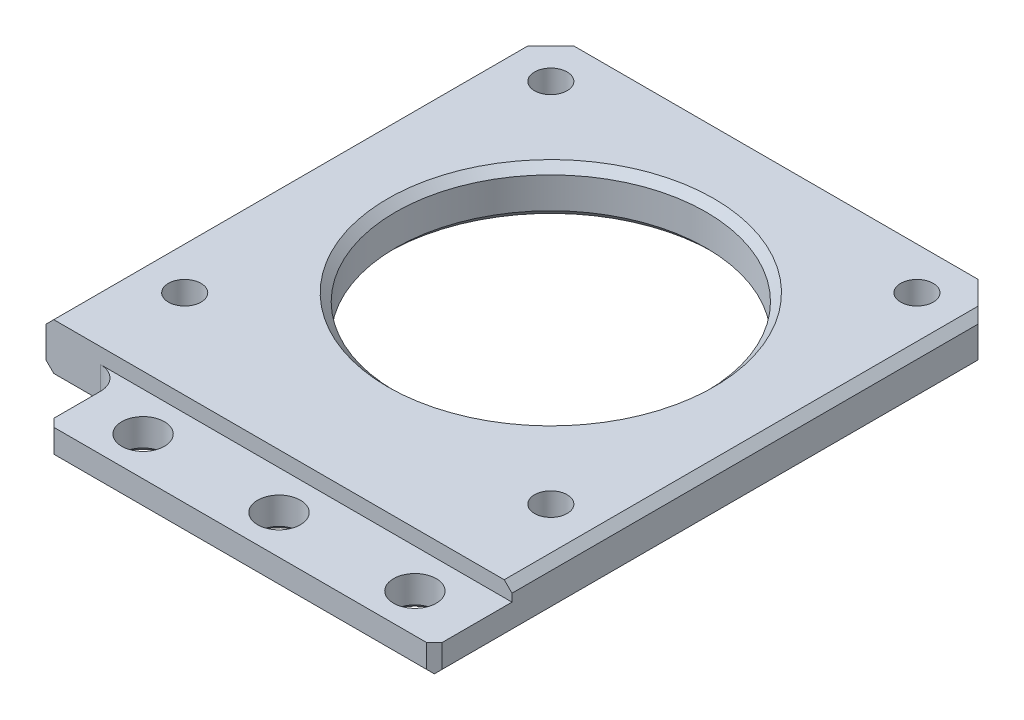
ISO-10303-21;
HEADER;
FILE_DESCRIPTION(('STEP AP214'),'2;1');
FILE_NAME('part.step','',(''),(''),'','','');
FILE_SCHEMA(('AUTOMOTIVE_DESIGN { 1 0 10303 214 1 1 1 1 }'));
ENDSEC;
DATA;
#1=APPLICATION_CONTEXT('core data for automotive mechanical design processes');
#2=APPLICATION_PROTOCOL_DEFINITION('international standard','automotive_design',2000,#1);
#3=PRODUCT_CONTEXT('',#1,'mechanical');
#4=PRODUCT('Part','Part','',(#3));
#5=PRODUCT_RELATED_PRODUCT_CATEGORY('part','',(#4));
#6=PRODUCT_DEFINITION_FORMATION('','',#4);
#7=PRODUCT_DEFINITION_CONTEXT('part definition',#1,'design');
#8=PRODUCT_DEFINITION('design','',#6,#7);
#9=PRODUCT_DEFINITION_SHAPE('','',#8);
#10=(LENGTH_UNIT() NAMED_UNIT(*) SI_UNIT(.MILLI.,.METRE.));
#11=(NAMED_UNIT(*) PLANE_ANGLE_UNIT() SI_UNIT($,.RADIAN.));
#12=(NAMED_UNIT(*) SI_UNIT($,.STERADIAN.) SOLID_ANGLE_UNIT());
#13=UNCERTAINTY_MEASURE_WITH_UNIT(LENGTH_MEASURE(1.E-05),#10,'distance_accuracy_value','');
#14=(GEOMETRIC_REPRESENTATION_CONTEXT(3) GLOBAL_UNCERTAINTY_ASSIGNED_CONTEXT((#13)) GLOBAL_UNIT_ASSIGNED_CONTEXT((#10,
#11,#12)) REPRESENTATION_CONTEXT('',''));
#15=CARTESIAN_POINT('',(0.,0.,0.));
#16=DIRECTION('',(0.,0.,1.));
#17=DIRECTION('',(1.,0.,0.));
#18=AXIS2_PLACEMENT_3D('',#15,#16,#17);
#19=CARTESIAN_POINT('',(52.5,0.500000000000011,-5.));
#20=DIRECTION('',(0.,-1.,0.));
#21=DIRECTION('',(0.,0.,-1.));
#22=AXIS2_PLACEMENT_3D('',#19,#20,#21);
#23=CONICAL_SURFACE('',#22,2.75,0.785398163397439);
#24=CARTESIAN_POINT('',(52.5,0.500000000000011,-5.));
#25=DIRECTION('',(0.,-1.,0.));
#26=DIRECTION('',(0.,0.,-1.));
#27=AXIS2_PLACEMENT_3D('',#24,#25,#26);
#28=CIRCLE('',#27,2.75);
#29=CARTESIAN_POINT('',(52.5,0.500000000000011,-7.75));
#30=VERTEX_POINT('',#29);
#31=EDGE_CURVE('E390',#30,#30,#28,.T.);
#32=ORIENTED_EDGE('',*,*,#31,.F.);
#33=EDGE_LOOP('',(#32));
#34=FACE_BOUND('',#33,.T.);
#35=CARTESIAN_POINT('',(52.5,0.,-5.));
#36=DIRECTION('',(0.,1.,0.));
#37=DIRECTION('',(0.,0.,-1.));
#38=AXIS2_PLACEMENT_3D('',#35,#36,#37);
#39=CIRCLE('',#38,3.25);
#40=CARTESIAN_POINT('',(52.5,0.,-8.25));
#41=VERTEX_POINT('',#40);
#42=EDGE_CURVE('E267',#41,#41,#39,.T.);
#43=ORIENTED_EDGE('',*,*,#42,.F.);
#44=EDGE_LOOP('',(#43));
#45=FACE_BOUND('',#44,.T.);
#46=ADVANCED_FACE('F17',(#34,#45),#23,.F.);
#47=CARTESIAN_POINT('',(35.,0.500000000000011,-5.));
#48=DIRECTION('',(0.,-1.,0.));
#49=DIRECTION('',(0.,0.,-1.));
#50=AXIS2_PLACEMENT_3D('',#47,#48,#49);
#51=CONICAL_SURFACE('',#50,2.75,0.785398163397439);
#52=CARTESIAN_POINT('',(35.,0.500000000000011,-5.));
#53=DIRECTION('',(0.,-1.,0.));
#54=DIRECTION('',(0.,0.,-1.));
#55=AXIS2_PLACEMENT_3D('',#52,#53,#54);
#56=CIRCLE('',#55,2.75);
#57=CARTESIAN_POINT('',(35.,0.500000000000011,-7.75));
#58=VERTEX_POINT('',#57);
#59=EDGE_CURVE('E286',#58,#58,#56,.T.);
#60=ORIENTED_EDGE('',*,*,#59,.F.);
#61=EDGE_LOOP('',(#60));
#62=FACE_BOUND('',#61,.T.);
#63=CARTESIAN_POINT('',(35.,0.,-5.));
#64=DIRECTION('',(0.,1.,0.));
#65=DIRECTION('',(0.,0.,-1.));
#66=AXIS2_PLACEMENT_3D('',#63,#64,#65);
#67=CIRCLE('',#66,3.25);
#68=CARTESIAN_POINT('',(35.,0.,-8.25));
#69=VERTEX_POINT('',#68);
#70=EDGE_CURVE('E293',#69,#69,#67,.T.);
#71=ORIENTED_EDGE('',*,*,#70,.F.);
#72=EDGE_LOOP('',(#71));
#73=FACE_BOUND('',#72,.T.);
#74=ADVANCED_FACE('F1122',(#62,#73),#51,.F.);
#75=CARTESIAN_POINT('',(17.5,0.500000000000014,-5.));
#76=DIRECTION('',(0.,-1.,0.));
#77=DIRECTION('',(0.,0.,-1.));
#78=AXIS2_PLACEMENT_3D('',#75,#76,#77);
#79=CONICAL_SURFACE('',#78,2.75,0.785398163397439);
#80=CARTESIAN_POINT('',(17.5,0.500000000000014,-5.));
#81=DIRECTION('',(0.,-1.,0.));
#82=DIRECTION('',(0.,0.,-1.));
#83=AXIS2_PLACEMENT_3D('',#80,#81,#82);
#84=CIRCLE('',#83,2.75);
#85=CARTESIAN_POINT('',(17.5,0.500000000000014,-7.75));
#86=VERTEX_POINT('',#85);
#87=EDGE_CURVE('E396',#86,#86,#84,.T.);
#88=ORIENTED_EDGE('',*,*,#87,.F.);
#89=EDGE_LOOP('',(#88));
#90=FACE_BOUND('',#89,.T.);
#91=CARTESIAN_POINT('',(17.5,0.,-5.));
#92=DIRECTION('',(0.,1.,0.));
#93=DIRECTION('',(0.,0.,-1.));
#94=AXIS2_PLACEMENT_3D('',#91,#92,#93);
#95=CIRCLE('',#94,3.25);
#96=CARTESIAN_POINT('',(17.5,0.,-8.25));
#97=VERTEX_POINT('',#96);
#98=EDGE_CURVE('E297',#97,#97,#95,.T.);
#99=ORIENTED_EDGE('',*,*,#98,.F.);
#100=EDGE_LOOP('',(#99));
#101=FACE_BOUND('',#100,.T.);
#102=ADVANCED_FACE('F1117',(#90,#101),#79,.F.);
#103=CARTESIAN_POINT('',(10.,0.,-1.00000000000001));
#104=DIRECTION('',(0.707106781186548,0.,-0.707106781186548));
#105=DIRECTION('',(0.,-1.,0.));
#106=AXIS2_PLACEMENT_3D('',#103,#104,#105);
#107=PLANE('',#106);
#108=DIRECTION('',(-0.577350269189626,-0.577350269189626,-0.577350269189626));
#109=VECTOR('',#108,1.);
#110=CARTESIAN_POINT('',(7.33333333333335,-2.66666666666668,-3.66666666666667));
#111=LINE('',#110,#109);
#112=CARTESIAN_POINT('',(11.,0.999999999999987,0.));
#113=VERTEX_POINT('',#112);
#114=CARTESIAN_POINT('',(10.,0.,-0.999999999999987));
#115=VERTEX_POINT('',#114);
#116=EDGE_CURVE('E232',#113,#115,#111,.T.);
#117=ORIENTED_EDGE('',*,*,#116,.F.);
#118=DIRECTION('',(0.,-1.,0.));
#119=VECTOR('',#118,1.);
#120=CARTESIAN_POINT('',(11.,6.,0.));
#121=LINE('',#120,#119);
#122=CARTESIAN_POINT('',(11.,4.,0.));
#123=VERTEX_POINT('',#122);
#124=EDGE_CURVE('E247',#123,#113,#121,.T.);
#125=ORIENTED_EDGE('',*,*,#124,.F.);
#126=DIRECTION('',(0.707106781186548,0.,0.707106781186548));
#127=VECTOR('',#126,1.);
#128=CARTESIAN_POINT('',(10.,4.,-1.00000000000001));
#129=LINE('',#128,#127);
#130=CARTESIAN_POINT('',(10.,4.,-1.00000000000001));
#131=VERTEX_POINT('',#130);
#132=EDGE_CURVE('E403',#131,#123,#129,.T.);
#133=ORIENTED_EDGE('',*,*,#132,.F.);
#134=DIRECTION('',(0.,1.,0.));
#135=VECTOR('',#134,1.);
#136=CARTESIAN_POINT('',(10.,0.,-1.00000000000001));
#137=LINE('',#136,#135);
#138=EDGE_CURVE('E26',#115,#131,#137,.T.);
#139=ORIENTED_EDGE('',*,*,#138,.F.);
#140=EDGE_LOOP('',(#117,#125,#133,#139));
#141=FACE_BOUND('',#140,.T.);
#142=ADVANCED_FACE('F1121',(#141),#107,.F.);
#143=CARTESIAN_POINT('',(7.,4.,-7.));
#144=DIRECTION('',(0.,-1.,0.));
#145=DIRECTION('',(0.,0.,-1.));
#146=AXIS2_PLACEMENT_3D('',#143,#144,#145);
#147=CYLINDRICAL_SURFACE('',#146,3.);
#148=CARTESIAN_POINT('',(7.,0.,-7.));
#149=DIRECTION('',(0.,1.,0.));
#150=DIRECTION('',(0.,0.,-1.));
#151=AXIS2_PLACEMENT_3D('',#148,#149,#150);
#152=CIRCLE('',#151,3.);
#153=CARTESIAN_POINT('',(10.,0.,-7.));
#154=VERTEX_POINT('',#153);
#155=CARTESIAN_POINT('',(7.,0.,-10.));
#156=VERTEX_POINT('',#155);
#157=EDGE_CURVE('E334',#154,#156,#152,.T.);
#158=ORIENTED_EDGE('',*,*,#157,.F.);
#159=DIRECTION('',(0.,-1.,0.));
#160=VECTOR('',#159,1.);
#161=CARTESIAN_POINT('',(10.,0.,-7.));
#162=LINE('',#161,#160);
#163=CARTESIAN_POINT('',(10.,4.,-7.));
#164=VERTEX_POINT('',#163);
#165=EDGE_CURVE('E11',#164,#154,#162,.T.);
#166=ORIENTED_EDGE('',*,*,#165,.F.);
#167=CARTESIAN_POINT('',(7.,4.,-7.));
#168=DIRECTION('',(0.,-1.,0.));
#169=DIRECTION('',(0.,0.,-1.));
#170=AXIS2_PLACEMENT_3D('',#167,#168,#169);
#171=CIRCLE('',#170,3.);
#172=CARTESIAN_POINT('',(7.,4.,-10.));
#173=VERTEX_POINT('',#172);
#174=EDGE_CURVE('E258',#173,#164,#171,.T.);
#175=ORIENTED_EDGE('',*,*,#174,.F.);
#176=DIRECTION('',(0.,1.,0.));
#177=VECTOR('',#176,1.);
#178=CARTESIAN_POINT('',(7.,4.,-10.));
#179=LINE('',#178,#177);
#180=EDGE_CURVE('E262',#156,#173,#179,.T.);
#181=ORIENTED_EDGE('',*,*,#180,.F.);
#182=EDGE_LOOP('',(#158,#166,#175,#181));
#183=FACE_BOUND('',#182,.T.);
#184=ADVANCED_FACE('F1140',(#183),#147,.F.);
#185=CARTESIAN_POINT('',(10.,0.,-10.));
#186=DIRECTION('',(1.,0.,0.));
#187=DIRECTION('',(0.,0.,-1.));
#188=AXIS2_PLACEMENT_3D('',#185,#186,#187);
#189=PLANE('',#188);
#190=DIRECTION('',(0.,0.,-1.));
#191=VECTOR('',#190,1.);
#192=CARTESIAN_POINT('',(10.,0.,-10.));
#193=LINE('',#192,#191);
#194=EDGE_CURVE('E339',#115,#154,#193,.T.);
#195=ORIENTED_EDGE('',*,*,#194,.F.);
#196=ORIENTED_EDGE('',*,*,#138,.T.);
#197=DIRECTION('',(0.,0.,-1.));
#198=VECTOR('',#197,1.);
#199=CARTESIAN_POINT('',(10.,4.,-10.));
#200=LINE('',#199,#198);
#201=EDGE_CURVE('E399',#131,#164,#200,.T.);
#202=ORIENTED_EDGE('',*,*,#201,.T.);
#203=ORIENTED_EDGE('',*,*,#165,.T.);
#204=EDGE_LOOP('',(#195,#196,#202,#203));
#205=FACE_BOUND('',#204,.T.);
#206=ADVANCED_FACE('F1135',(#205),#189,.F.);
#207=CARTESIAN_POINT('',(6.43,0.,-21.43));
#208=DIRECTION('',(0.,-1.,0.));
#209=DIRECTION('',(0.,0.,-1.));
#210=AXIS2_PLACEMENT_3D('',#207,#208,#209);
#211=CONICAL_SURFACE('',#210,2.525,0.785398163397445);
#212=CARTESIAN_POINT('',(6.43,0.425,-21.43));
#213=DIRECTION('',(0.,-1.,0.));
#214=DIRECTION('',(0.,0.,-1.));
#215=AXIS2_PLACEMENT_3D('',#212,#213,#214);
#216=CIRCLE('',#215,2.1);
#217=CARTESIAN_POINT('',(6.43,0.425,-23.53));
#218=VERTEX_POINT('',#217);
#219=EDGE_CURVE('E38',#218,#218,#216,.T.);
#220=ORIENTED_EDGE('',*,*,#219,.F.);
#221=EDGE_LOOP('',(#220));
#222=FACE_BOUND('',#221,.T.);
#223=CARTESIAN_POINT('',(6.43,0.,-21.43));
#224=DIRECTION('',(0.,-1.,0.));
#225=DIRECTION('',(0.,0.,-1.));
#226=AXIS2_PLACEMENT_3D('',#223,#224,#225);
#227=CIRCLE('',#226,2.525);
#228=CARTESIAN_POINT('',(6.43,0.,-23.955));
#229=VERTEX_POINT('',#228);
#230=EDGE_CURVE('E264',#229,#229,#227,.T.);
#231=ORIENTED_EDGE('',*,*,#230,.T.);
#232=EDGE_LOOP('',(#231));
#233=FACE_BOUND('',#232,.T.);
#234=ADVANCED_FACE('F1139',(#222,#233),#211,.F.);
#235=CARTESIAN_POINT('',(6.43,0.,-21.43));
#236=DIRECTION('',(0.,-1.,0.));
#237=DIRECTION('',(0.,0.,-1.));
#238=AXIS2_PLACEMENT_3D('',#235,#236,#237);
#239=CYLINDRICAL_SURFACE('',#238,2.1);
#240=CARTESIAN_POINT('',(6.43,6.,-21.43));
#241=DIRECTION('',(0.,-1.,0.));
#242=DIRECTION('',(0.,0.,-1.));
#243=AXIS2_PLACEMENT_3D('',#240,#241,#242);
#244=CIRCLE('',#243,2.1);
#245=CARTESIAN_POINT('',(6.43,6.,-23.53));
#246=VERTEX_POINT('',#245);
#247=EDGE_CURVE('E243',#246,#246,#244,.T.);
#248=ORIENTED_EDGE('',*,*,#247,.F.);
#249=EDGE_LOOP('',(#248));
#250=FACE_BOUND('',#249,.T.);
#251=ORIENTED_EDGE('',*,*,#219,.T.);
#252=EDGE_LOOP('',(#251));
#253=FACE_BOUND('',#252,.T.);
#254=ADVANCED_FACE('F1049',(#250,#253),#239,.F.);
#255=CARTESIAN_POINT('',(53.57,0.,-68.57));
#256=DIRECTION('',(0.,-1.,0.));
#257=DIRECTION('',(0.,0.,-1.));
#258=AXIS2_PLACEMENT_3D('',#255,#256,#257);
#259=CONICAL_SURFACE('',#258,2.525,0.785398163397445);
#260=CARTESIAN_POINT('',(53.57,0.425,-68.57));
#261=DIRECTION('',(0.,-1.,0.));
#262=DIRECTION('',(0.,0.,-1.));
#263=AXIS2_PLACEMENT_3D('',#260,#261,#262);
#264=CIRCLE('',#263,2.1);
#265=CARTESIAN_POINT('',(53.57,0.425,-70.67));
#266=VERTEX_POINT('',#265);
#267=EDGE_CURVE('E160',#266,#266,#264,.T.);
#268=ORIENTED_EDGE('',*,*,#267,.F.);
#269=EDGE_LOOP('',(#268));
#270=FACE_BOUND('',#269,.T.);
#271=CARTESIAN_POINT('',(53.57,0.,-68.57));
#272=DIRECTION('',(0.,-1.,0.));
#273=DIRECTION('',(0.,0.,-1.));
#274=AXIS2_PLACEMENT_3D('',#271,#272,#273);
#275=CIRCLE('',#274,2.525);
#276=CARTESIAN_POINT('',(53.57,0.,-71.095));
#277=VERTEX_POINT('',#276);
#278=EDGE_CURVE('E199',#277,#277,#275,.T.);
#279=ORIENTED_EDGE('',*,*,#278,.T.);
#280=EDGE_LOOP('',(#279));
#281=FACE_BOUND('',#280,.T.);
#282=ADVANCED_FACE('F1044',(#270,#281),#259,.F.);
#283=CARTESIAN_POINT('',(53.57,0.,-68.57));
#284=DIRECTION('',(0.,-1.,0.));
#285=DIRECTION('',(0.,0.,-1.));
#286=AXIS2_PLACEMENT_3D('',#283,#284,#285);
#287=CYLINDRICAL_SURFACE('',#286,2.1);
#288=CARTESIAN_POINT('',(53.57,6.,-68.57));
#289=DIRECTION('',(0.,-1.,0.));
#290=DIRECTION('',(0.,0.,-1.));
#291=AXIS2_PLACEMENT_3D('',#288,#289,#290);
#292=CIRCLE('',#291,2.1);
#293=CARTESIAN_POINT('',(53.57,6.,-70.67));
#294=VERTEX_POINT('',#293);
#295=EDGE_CURVE('E238',#294,#294,#292,.T.);
#296=ORIENTED_EDGE('',*,*,#295,.F.);
#297=EDGE_LOOP('',(#296));
#298=FACE_BOUND('',#297,.T.);
#299=ORIENTED_EDGE('',*,*,#267,.T.);
#300=EDGE_LOOP('',(#299));
#301=FACE_BOUND('',#300,.T.);
#302=ADVANCED_FACE('F1048',(#298,#301),#287,.F.);
#303=CARTESIAN_POINT('',(53.57,0.,-21.43));
#304=DIRECTION('',(0.,-1.,0.));
#305=DIRECTION('',(0.,0.,-1.));
#306=AXIS2_PLACEMENT_3D('',#303,#304,#305);
#307=CONICAL_SURFACE('',#306,2.525,0.785398163397445);
#308=CARTESIAN_POINT('',(53.57,0.425,-21.43));
#309=DIRECTION('',(0.,-1.,0.));
#310=DIRECTION('',(0.,0.,-1.));
#311=AXIS2_PLACEMENT_3D('',#308,#309,#310);
#312=CIRCLE('',#311,2.1);
#313=CARTESIAN_POINT('',(53.57,0.425,-23.53));
#314=VERTEX_POINT('',#313);
#315=EDGE_CURVE('E156',#314,#314,#312,.T.);
#316=ORIENTED_EDGE('',*,*,#315,.F.);
#317=EDGE_LOOP('',(#316));
#318=FACE_BOUND('',#317,.T.);
#319=CARTESIAN_POINT('',(53.57,0.,-21.43));
#320=DIRECTION('',(0.,-1.,0.));
#321=DIRECTION('',(0.,0.,-1.));
#322=AXIS2_PLACEMENT_3D('',#319,#320,#321);
#323=CIRCLE('',#322,2.525);
#324=CARTESIAN_POINT('',(53.57,0.,-23.955));
#325=VERTEX_POINT('',#324);
#326=EDGE_CURVE('E196',#325,#325,#323,.T.);
#327=ORIENTED_EDGE('',*,*,#326,.T.);
#328=EDGE_LOOP('',(#327));
#329=FACE_BOUND('',#328,.T.);
#330=ADVANCED_FACE('F1111',(#318,#329),#307,.F.);
#331=CARTESIAN_POINT('',(53.57,0.,-21.43));
#332=DIRECTION('',(0.,-1.,0.));
#333=DIRECTION('',(0.,0.,-1.));
#334=AXIS2_PLACEMENT_3D('',#331,#332,#333);
#335=CYLINDRICAL_SURFACE('',#334,2.1);
#336=CARTESIAN_POINT('',(53.57,6.,-21.43));
#337=DIRECTION('',(0.,-1.,0.));
#338=DIRECTION('',(0.,0.,-1.));
#339=AXIS2_PLACEMENT_3D('',#336,#337,#338);
#340=CIRCLE('',#339,2.1);
#341=CARTESIAN_POINT('',(53.57,6.,-23.53));
#342=VERTEX_POINT('',#341);
#343=EDGE_CURVE('E242',#342,#342,#340,.T.);
#344=ORIENTED_EDGE('',*,*,#343,.F.);
#345=EDGE_LOOP('',(#344));
#346=FACE_BOUND('',#345,.T.);
#347=ORIENTED_EDGE('',*,*,#315,.T.);
#348=EDGE_LOOP('',(#347));
#349=FACE_BOUND('',#348,.T.);
#350=ADVANCED_FACE('F157',(#346,#349),#335,.F.);
#351=CARTESIAN_POINT('',(6.43,0.,-68.57));
#352=DIRECTION('',(0.,-1.,0.));
#353=DIRECTION('',(0.,0.,-1.));
#354=AXIS2_PLACEMENT_3D('',#351,#352,#353);
#355=CONICAL_SURFACE('',#354,2.525,0.785398163397445);
#356=CARTESIAN_POINT('',(6.43,0.425,-68.57));
#357=DIRECTION('',(0.,-1.,0.));
#358=DIRECTION('',(0.,0.,-1.));
#359=AXIS2_PLACEMENT_3D('',#356,#357,#358);
#360=CIRCLE('',#359,2.1);
#361=CARTESIAN_POINT('',(6.43,0.425,-70.67));
#362=VERTEX_POINT('',#361);
#363=EDGE_CURVE('E148',#362,#362,#360,.T.);
#364=ORIENTED_EDGE('',*,*,#363,.F.);
#365=EDGE_LOOP('',(#364));
#366=FACE_BOUND('',#365,.T.);
#367=CARTESIAN_POINT('',(6.43,0.,-68.57));
#368=DIRECTION('',(0.,-1.,0.));
#369=DIRECTION('',(0.,0.,-1.));
#370=AXIS2_PLACEMENT_3D('',#367,#368,#369);
#371=CIRCLE('',#370,2.525);
#372=CARTESIAN_POINT('',(6.43,0.,-71.095));
#373=VERTEX_POINT('',#372);
#374=EDGE_CURVE('E195',#373,#373,#371,.T.);
#375=ORIENTED_EDGE('',*,*,#374,.T.);
#376=EDGE_LOOP('',(#375));
#377=FACE_BOUND('',#376,.T.);
#378=ADVANCED_FACE('F1082',(#366,#377),#355,.F.);
#379=CARTESIAN_POINT('',(6.43,0.,-68.57));
#380=DIRECTION('',(0.,-1.,0.));
#381=DIRECTION('',(0.,0.,-1.));
#382=AXIS2_PLACEMENT_3D('',#379,#380,#381);
#383=CYLINDRICAL_SURFACE('',#382,2.1);
#384=CARTESIAN_POINT('',(6.43,6.,-68.57));
#385=DIRECTION('',(0.,-1.,0.));
#386=DIRECTION('',(0.,0.,-1.));
#387=AXIS2_PLACEMENT_3D('',#384,#385,#386);
#388=CIRCLE('',#387,2.1);
#389=CARTESIAN_POINT('',(6.43,6.,-70.67));
#390=VERTEX_POINT('',#389);
#391=EDGE_CURVE('E346',#390,#390,#388,.T.);
#392=ORIENTED_EDGE('',*,*,#391,.F.);
#393=EDGE_LOOP('',(#392));
#394=FACE_BOUND('',#393,.T.);
#395=ORIENTED_EDGE('',*,*,#363,.T.);
#396=EDGE_LOOP('',(#395));
#397=FACE_BOUND('',#396,.T.);
#398=ADVANCED_FACE('F1086',(#394,#397),#383,.F.);
#399=CARTESIAN_POINT('',(30.,0.,-45.));
#400=DIRECTION('',(0.,-1.,0.));
#401=DIRECTION('',(0.,0.,-1.));
#402=AXIS2_PLACEMENT_3D('',#399,#400,#401);
#403=CONICAL_SURFACE('',#402,21.,0.785398163397452);
#404=CARTESIAN_POINT('',(30.,1.,-45.));
#405=DIRECTION('',(0.,-1.,0.));
#406=DIRECTION('',(0.,0.,-1.));
#407=AXIS2_PLACEMENT_3D('',#404,#405,#406);
#408=CIRCLE('',#407,20.);
#409=CARTESIAN_POINT('',(30.,1.,-65.));
#410=VERTEX_POINT('',#409);
#411=EDGE_CURVE('E194',#410,#410,#408,.T.);
#412=ORIENTED_EDGE('',*,*,#411,.F.);
#413=EDGE_LOOP('',(#412));
#414=FACE_BOUND('',#413,.T.);
#415=CARTESIAN_POINT('',(30.,0.,-45.));
#416=DIRECTION('',(0.,1.,0.));
#417=DIRECTION('',(0.,0.,-1.));
#418=AXIS2_PLACEMENT_3D('',#415,#416,#417);
#419=CIRCLE('',#418,21.);
#420=CARTESIAN_POINT('',(30.,0.,-66.));
#421=VERTEX_POINT('',#420);
#422=EDGE_CURVE('E190',#421,#421,#419,.T.);
#423=ORIENTED_EDGE('',*,*,#422,.F.);
#424=EDGE_LOOP('',(#423));
#425=FACE_BOUND('',#424,.T.);
#426=ADVANCED_FACE('F1076',(#414,#425),#403,.F.);
#427=CARTESIAN_POINT('',(30.,5.,-45.));
#428=DIRECTION('',(0.,1.,0.));
#429=DIRECTION('',(0.,0.,1.));
#430=AXIS2_PLACEMENT_3D('',#427,#428,#429);
#431=CONICAL_SURFACE('',#430,20.,0.785398163397448);
#432=CARTESIAN_POINT('',(30.,5.,-45.));
#433=DIRECTION('',(0.,1.,0.));
#434=DIRECTION('',(0.,0.,-1.));
#435=AXIS2_PLACEMENT_3D('',#432,#433,#434);
#436=CIRCLE('',#435,20.);
#437=CARTESIAN_POINT('',(30.,5.,-65.));
#438=VERTEX_POINT('',#437);
#439=EDGE_CURVE('E251',#438,#438,#436,.T.);
#440=ORIENTED_EDGE('',*,*,#439,.F.);
#441=EDGE_LOOP('',(#440));
#442=FACE_BOUND('',#441,.T.);
#443=CARTESIAN_POINT('',(30.,6.,-45.));
#444=DIRECTION('',(0.,-1.,0.));
#445=DIRECTION('',(0.,0.,-1.));
#446=AXIS2_PLACEMENT_3D('',#443,#444,#445);
#447=CIRCLE('',#446,21.);
#448=CARTESIAN_POINT('',(30.,6.,-66.));
#449=VERTEX_POINT('',#448);
#450=EDGE_CURVE('E350',#449,#449,#447,.T.);
#451=ORIENTED_EDGE('',*,*,#450,.F.);
#452=EDGE_LOOP('',(#451));
#453=FACE_BOUND('',#452,.T.);
#454=ADVANCED_FACE('F1059',(#442,#453),#431,.F.);
#455=CARTESIAN_POINT('',(60.,6.,-1.));
#456=DIRECTION('',(-0.707106781186548,0.,-0.707106781186548));
#457=DIRECTION('',(-0.707106781186548,0.,0.707106781186548));
#458=AXIS2_PLACEMENT_3D('',#455,#456,#457);
#459=PLANE('',#458);
#460=DIRECTION('',(0.707106781186548,0.,-0.707106781186548));
#461=VECTOR('',#460,1.);
#462=CARTESIAN_POINT('',(60.,4.,-1.));
#463=LINE('',#462,#461);
#464=CARTESIAN_POINT('',(59.,4.,0.));
#465=VERTEX_POINT('',#464);
#466=CARTESIAN_POINT('',(60.,4.,-1.));
#467=VERTEX_POINT('',#466);
#468=EDGE_CURVE('E407',#465,#467,#463,.T.);
#469=ORIENTED_EDGE('',*,*,#468,.F.);
#470=DIRECTION('',(0.,1.,0.));
#471=VECTOR('',#470,1.);
#472=CARTESIAN_POINT('',(59.,6.,0.));
#473=LINE('',#472,#471);
#474=CARTESIAN_POINT('',(59.,0.999999999999987,0.));
#475=VERTEX_POINT('',#474);
#476=EDGE_CURVE('E211',#475,#465,#473,.T.);
#477=ORIENTED_EDGE('',*,*,#476,.F.);
#478=DIRECTION('',(-0.577350269189626,0.577350269189626,0.577350269189626));
#479=VECTOR('',#478,1.);
#480=CARTESIAN_POINT('',(39.3333333333333,20.6666666666667,19.6666666666666));
#481=LINE('',#480,#479);
#482=CARTESIAN_POINT('',(59.5,0.499999999999983,-0.5));
#483=VERTEX_POINT('',#482);
#484=EDGE_CURVE('E207',#483,#475,#481,.T.);
#485=ORIENTED_EDGE('',*,*,#484,.F.);
#486=DIRECTION('',(-0.577350269189626,-0.577350269189626,0.577350269189626));
#487=VECTOR('',#486,1.);
#488=CARTESIAN_POINT('',(59.6666666666667,0.666666666666654,-0.666666666666667));
#489=LINE('',#488,#487);
#490=CARTESIAN_POINT('',(60.,0.999999999999987,-1.));
#491=VERTEX_POINT('',#490);
#492=EDGE_CURVE('E168',#491,#483,#489,.T.);
#493=ORIENTED_EDGE('',*,*,#492,.F.);
#494=DIRECTION('',(0.,-1.,0.));
#495=VECTOR('',#494,1.);
#496=CARTESIAN_POINT('',(60.,6.,-1.));
#497=LINE('',#496,#495);
#498=EDGE_CURVE('E200',#467,#491,#497,.T.);
#499=ORIENTED_EDGE('',*,*,#498,.F.);
#500=EDGE_LOOP('',(#469,#477,#485,#493,#499));
#501=FACE_BOUND('',#500,.T.);
#502=ADVANCED_FACE('F1055',(#501),#459,.F.);
#503=CARTESIAN_POINT('',(60.,0.999999999999987,0.));
#504=DIRECTION('',(0.707106781186548,-0.707106781186548,0.));
#505=DIRECTION('',(0.,0.,-1.));
#506=AXIS2_PLACEMENT_3D('',#503,#504,#505);
#507=PLANE('',#506);
#508=DIRECTION('',(0.,0.,-1.));
#509=VECTOR('',#508,1.);
#510=CARTESIAN_POINT('',(60.,0.999999999999987,-70.));
#511=LINE('',#510,#509);
#512=CARTESIAN_POINT('',(60.,0.999999999999987,-70.));
#513=VERTEX_POINT('',#512);
#514=EDGE_CURVE('E186',#491,#513,#511,.T.);
#515=ORIENTED_EDGE('',*,*,#514,.F.);
#516=ORIENTED_EDGE('',*,*,#492,.T.);
#517=DIRECTION('',(-0.577350269189626,-0.577350269189626,-0.577350269189626));
#518=VECTOR('',#517,1.);
#519=CARTESIAN_POINT('',(40.,-19.,-20.));
#520=LINE('',#519,#518);
#521=CARTESIAN_POINT('',(59.,0.,-0.999999999999987));
#522=VERTEX_POINT('',#521);
#523=EDGE_CURVE('E236',#483,#522,#520,.T.);
#524=ORIENTED_EDGE('',*,*,#523,.T.);
#525=DIRECTION('',(0.,0.,1.));
#526=VECTOR('',#525,1.);
#527=CARTESIAN_POINT('',(59.,0.,0.));
#528=LINE('',#527,#526);
#529=CARTESIAN_POINT('',(59.,0.,-71.));
#530=VERTEX_POINT('',#529);
#531=EDGE_CURVE('E305',#530,#522,#528,.T.);
#532=ORIENTED_EDGE('',*,*,#531,.F.);
#533=DIRECTION('',(-0.577350269189625,-0.577350269189625,-0.577350269189627));
#534=VECTOR('',#533,1.);
#535=CARTESIAN_POINT('',(58.3333333333333,-0.666666666666685,-71.6666666666667));
#536=LINE('',#535,#534);
#537=EDGE_CURVE('E325',#513,#530,#536,.T.);
#538=ORIENTED_EDGE('',*,*,#537,.F.);
#539=EDGE_LOOP('',(#515,#516,#524,#532,#538));
#540=FACE_BOUND('',#539,.T.);
#541=ADVANCED_FACE('F1038',(#540),#507,.T.);
#542=CARTESIAN_POINT('',(0.,0.999999999999987,0.));
#543=DIRECTION('',(0.,-0.707106781186548,0.707106781186548));
#544=DIRECTION('',(-1.,0.,0.));
#545=AXIS2_PLACEMENT_3D('',#542,#543,#544);
#546=PLANE('',#545);
#547=DIRECTION('',(1.,0.,0.));
#548=VECTOR('',#547,1.);
#549=CARTESIAN_POINT('',(60.,0.999999999999987,0.));
#550=LINE('',#549,#548);
#551=EDGE_CURVE('E215',#113,#475,#550,.T.);
#552=ORIENTED_EDGE('',*,*,#551,.F.);
#553=ORIENTED_EDGE('',*,*,#116,.T.);
#554=DIRECTION('',(-1.,0.,0.));
#555=VECTOR('',#554,1.);
#556=CARTESIAN_POINT('',(0.,0.,-0.999999999999987));
#557=LINE('',#556,#555);
#558=EDGE_CURVE('E301',#522,#115,#557,.T.);
#559=ORIENTED_EDGE('',*,*,#558,.F.);
#560=ORIENTED_EDGE('',*,*,#523,.F.);
#561=ORIENTED_EDGE('',*,*,#484,.T.);
#562=EDGE_LOOP('',(#552,#553,#559,#560,#561));
#563=FACE_BOUND('',#562,.T.);
#564=ADVANCED_FACE('F1029',(#563),#546,.T.);
#565=CARTESIAN_POINT('',(0.,0.999999999999987,0.));
#566=DIRECTION('',(-0.707106781186548,-0.707106781186548,0.));
#567=DIRECTION('',(-0.707106781186548,0.707106781186548,0.));
#568=AXIS2_PLACEMENT_3D('',#565,#566,#567);
#569=PLANE('',#568);
#570=DIRECTION('',(0.707106781186548,-0.707106781186548,0.));
#571=VECTOR('',#570,1.);
#572=CARTESIAN_POINT('',(0.,0.999999999999986,-10.));
#573=LINE('',#572,#571);
#574=CARTESIAN_POINT('',(0.,0.999999999999985,-10.));
#575=VERTEX_POINT('',#574);
#576=CARTESIAN_POINT('',(0.999999999999988,0.,-10.));
#577=VERTEX_POINT('',#576);
#578=EDGE_CURVE('E424',#575,#577,#573,.T.);
#579=ORIENTED_EDGE('',*,*,#578,.F.);
#580=DIRECTION('',(0.,0.,1.));
#581=VECTOR('',#580,1.);
#582=CARTESIAN_POINT('',(0.,0.999999999999987,0.));
#583=LINE('',#582,#581);
#584=CARTESIAN_POINT('',(0.,0.999999999999987,-70.));
#585=VERTEX_POINT('',#584);
#586=EDGE_CURVE('E171',#585,#575,#583,.T.);
#587=ORIENTED_EDGE('',*,*,#586,.F.);
#588=DIRECTION('',(-0.577350269189626,0.577350269189626,0.577350269189626));
#589=VECTOR('',#588,1.);
#590=CARTESIAN_POINT('',(-1.66666666666668,2.66666666666666,-68.3333333333333));
#591=LINE('',#590,#589);
#592=CARTESIAN_POINT('',(0.99999999999998,0.,-71.));
#593=VERTEX_POINT('',#592);
#594=EDGE_CURVE('E434',#593,#585,#591,.T.);
#595=ORIENTED_EDGE('',*,*,#594,.F.);
#596=DIRECTION('',(0.,0.,-1.));
#597=VECTOR('',#596,1.);
#598=CARTESIAN_POINT('',(0.999999999999974,0.,-70.));
#599=LINE('',#598,#597);
#600=EDGE_CURVE('E360',#577,#593,#599,.T.);
#601=ORIENTED_EDGE('',*,*,#600,.F.);
#602=EDGE_LOOP('',(#579,#587,#595,#601));
#603=FACE_BOUND('',#602,.T.);
#604=ADVANCED_FACE('F1020',(#603),#569,.T.);
#605=CARTESIAN_POINT('',(1.00000000000001,6.,0.));
#606=DIRECTION('',(0.707106781186548,-0.707106781186548,0.));
#607=DIRECTION('',(0.,0.,-1.));
#608=AXIS2_PLACEMENT_3D('',#605,#606,#607);
#609=PLANE('',#608);
#610=DIRECTION('',(0.577350269189626,0.577350269189626,-0.577350269189626));
#611=VECTOR('',#610,1.);
#612=CARTESIAN_POINT('',(0.333333333333326,5.33333333333332,-70.3333333333333));
#613=LINE('',#612,#611);
#614=CARTESIAN_POINT('',(0.,5.,-70.));
#615=VERTEX_POINT('',#614);
#616=CARTESIAN_POINT('',(1.,6.,-71.));
#617=VERTEX_POINT('',#616);
#618=EDGE_CURVE('E326',#615,#617,#613,.T.);
#619=ORIENTED_EDGE('',*,*,#618,.F.);
#620=DIRECTION('',(0.,0.,-1.));
#621=VECTOR('',#620,1.);
#622=CARTESIAN_POINT('',(0.,5.,0.));
#623=LINE('',#622,#621);
#624=CARTESIAN_POINT('',(0.,5.,-10.));
#625=VERTEX_POINT('',#624);
#626=EDGE_CURVE('E176',#625,#615,#623,.T.);
#627=ORIENTED_EDGE('',*,*,#626,.F.);
#628=DIRECTION('',(-0.707106781186548,-0.707106781186548,0.));
#629=VECTOR('',#628,1.);
#630=CARTESIAN_POINT('',(1.00000000000001,6.,-10.));
#631=LINE('',#630,#629);
#632=CARTESIAN_POINT('',(1.00000000000001,6.,-10.));
#633=VERTEX_POINT('',#632);
#634=EDGE_CURVE('E420',#633,#625,#631,.T.);
#635=ORIENTED_EDGE('',*,*,#634,.F.);
#636=DIRECTION('',(0.,0.,1.));
#637=VECTOR('',#636,1.);
#638=CARTESIAN_POINT('',(1.00000000000001,6.,0.));
#639=LINE('',#638,#637);
#640=EDGE_CURVE('E330',#617,#633,#639,.T.);
#641=ORIENTED_EDGE('',*,*,#640,.F.);
#642=EDGE_LOOP('',(#619,#627,#635,#641));
#643=FACE_BOUND('',#642,.T.);
#644=ADVANCED_FACE('F1011',(#643),#609,.F.);
#645=CARTESIAN_POINT('',(0.,1.,-75.));
#646=DIRECTION('',(0.,-0.707106781186548,-0.707106781186548));
#647=DIRECTION('',(0.,-0.707106781186548,0.707106781186548));
#648=AXIS2_PLACEMENT_3D('',#645,#646,#647);
#649=PLANE('',#648);
#650=DIRECTION('',(-0.577350269189625,0.577350269189626,-0.577350269189626));
#651=VECTOR('',#650,1.);
#652=CARTESIAN_POINT('',(53.3333333333333,2.66666666666667,-76.6666666666667));
#653=LINE('',#652,#651);
#654=CARTESIAN_POINT('',(56.,0.,-74.));
#655=VERTEX_POINT('',#654);
#656=CARTESIAN_POINT('',(55.,1.,-75.));
#657=VERTEX_POINT('',#656);
#658=EDGE_CURVE('E443',#655,#657,#653,.T.);
#659=ORIENTED_EDGE('',*,*,#658,.F.);
#660=DIRECTION('',(1.,0.,0.));
#661=VECTOR('',#660,1.);
#662=CARTESIAN_POINT('',(55.,0.,-74.));
#663=LINE('',#662,#661);
#664=CARTESIAN_POINT('',(4.,0.,-74.));
#665=VERTEX_POINT('',#664);
#666=EDGE_CURVE('E216',#665,#655,#663,.T.);
#667=ORIENTED_EDGE('',*,*,#666,.F.);
#668=DIRECTION('',(-0.577350269189626,-0.577350269189626,0.577350269189626));
#669=VECTOR('',#668,1.);
#670=CARTESIAN_POINT('',(3.33333333333333,-0.666666666666679,-73.3333333333333));
#671=LINE('',#670,#669);
#672=CARTESIAN_POINT('',(5.,1.,-75.));
#673=VERTEX_POINT('',#672);
#674=EDGE_CURVE('E431',#673,#665,#671,.T.);
#675=ORIENTED_EDGE('',*,*,#674,.F.);
#676=DIRECTION('',(-1.,0.,0.));
#677=VECTOR('',#676,1.);
#678=CARTESIAN_POINT('',(5.,1.,-75.));
#679=LINE('',#678,#677);
#680=EDGE_CURVE('E277',#657,#673,#679,.T.);
#681=ORIENTED_EDGE('',*,*,#680,.F.);
#682=EDGE_LOOP('',(#659,#667,#675,#681));
#683=FACE_BOUND('',#682,.T.);
#684=ADVANCED_FACE('F1002',(#683),#649,.T.);
#685=CARTESIAN_POINT('',(0.,6.,-74.));
#686=DIRECTION('',(0.,-0.707106781186548,0.707106781186548));
#687=DIRECTION('',(-1.,0.,0.));
#688=AXIS2_PLACEMENT_3D('',#685,#686,#687);
#689=PLANE('',#688);
#690=DIRECTION('',(0.577350269189625,0.577350269189626,0.577350269189626));
#691=VECTOR('',#690,1.);
#692=CARTESIAN_POINT('',(55.3333333333333,5.33333333333334,-74.6666666666667));
#693=LINE('',#692,#691);
#694=CARTESIAN_POINT('',(55.,5.,-75.));
#695=VERTEX_POINT('',#694);
#696=CARTESIAN_POINT('',(56.,6.,-74.));
#697=VERTEX_POINT('',#696);
#698=EDGE_CURVE('E237',#695,#697,#693,.T.);
#699=ORIENTED_EDGE('',*,*,#698,.F.);
#700=DIRECTION('',(1.,0.,0.));
#701=VECTOR('',#700,1.);
#702=CARTESIAN_POINT('',(0.,5.,-75.));
#703=LINE('',#702,#701);
#704=CARTESIAN_POINT('',(5.,5.,-75.));
#705=VERTEX_POINT('',#704);
#706=EDGE_CURVE('E226',#705,#695,#703,.T.);
#707=ORIENTED_EDGE('',*,*,#706,.F.);
#708=DIRECTION('',(0.577350269189626,-0.577350269189626,-0.577350269189626));
#709=VECTOR('',#708,1.);
#710=CARTESIAN_POINT('',(1.33333333333333,8.66666666666669,-71.3333333333333));
#711=LINE('',#710,#709);
#712=CARTESIAN_POINT('',(4.,6.,-74.));
#713=VERTEX_POINT('',#712);
#714=EDGE_CURVE('E427',#713,#705,#711,.T.);
#715=ORIENTED_EDGE('',*,*,#714,.F.);
#716=DIRECTION('',(-1.,0.,0.));
#717=VECTOR('',#716,1.);
#718=CARTESIAN_POINT('',(0.,6.,-74.));
#719=LINE('',#718,#717);
#720=EDGE_CURVE('E316',#697,#713,#719,.T.);
#721=ORIENTED_EDGE('',*,*,#720,.F.);
#722=EDGE_LOOP('',(#699,#707,#715,#721));
#723=FACE_BOUND('',#722,.T.);
#724=ADVANCED_FACE('F868',(#723),#689,.F.);
#725=CARTESIAN_POINT('',(59.,6.,0.));
#726=DIRECTION('',(-0.707106781186548,-0.707106781186548,0.));
#727=DIRECTION('',(-0.707106781186548,0.707106781186548,0.));
#728=AXIS2_PLACEMENT_3D('',#725,#726,#727);
#729=PLANE('',#728);
#730=DIRECTION('',(-0.707106781186548,0.707106781186548,0.));
#731=VECTOR('',#730,1.);
#732=CARTESIAN_POINT('',(59.,6.,-10.));
#733=LINE('',#732,#731);
#734=CARTESIAN_POINT('',(60.,5.,-10.));
#735=VERTEX_POINT('',#734);
#736=CARTESIAN_POINT('',(59.,6.,-10.));
#737=VERTEX_POINT('',#736);
#738=EDGE_CURVE('E416',#735,#737,#733,.T.);
#739=ORIENTED_EDGE('',*,*,#738,.F.);
#740=DIRECTION('',(0.,0.,1.));
#741=VECTOR('',#740,1.);
#742=CARTESIAN_POINT('',(60.,5.,0.));
#743=LINE('',#742,#741);
#744=CARTESIAN_POINT('',(60.,5.,-70.));
#745=VERTEX_POINT('',#744);
#746=EDGE_CURVE('E185',#745,#735,#743,.T.);
#747=ORIENTED_EDGE('',*,*,#746,.F.);
#748=DIRECTION('',(0.577350269189625,-0.577350269189625,0.577350269189627));
#749=VECTOR('',#748,1.);
#750=CARTESIAN_POINT('',(56.3333333333333,8.66666666666666,-73.6666666666667));
#751=LINE('',#750,#749);
#752=CARTESIAN_POINT('',(59.,6.,-71.));
#753=VERTEX_POINT('',#752);
#754=EDGE_CURVE('E321',#753,#745,#751,.T.);
#755=ORIENTED_EDGE('',*,*,#754,.F.);
#756=DIRECTION('',(0.,0.,-1.));
#757=VECTOR('',#756,1.);
#758=CARTESIAN_POINT('',(59.,6.,0.));
#759=LINE('',#758,#757);
#760=EDGE_CURVE('E276',#737,#753,#759,.T.);
#761=ORIENTED_EDGE('',*,*,#760,.F.);
#762=EDGE_LOOP('',(#739,#747,#755,#761));
#763=FACE_BOUND('',#762,.T.);
#764=ADVANCED_FACE('F863',(#763),#729,.F.);
#765=CARTESIAN_POINT('',(55.,6.,-75.));
#766=DIRECTION('',(-0.707106781186549,0.,0.707106781186547));
#767=DIRECTION('',(0.,1.,0.));
#768=AXIS2_PLACEMENT_3D('',#765,#766,#767);
#769=PLANE('',#768);
#770=DIRECTION('',(-0.707106781186547,0.,-0.707106781186549));
#771=VECTOR('',#770,1.);
#772=CARTESIAN_POINT('',(55.,6.,-75.));
#773=LINE('',#772,#771);
#774=EDGE_CURVE('E312',#753,#697,#773,.T.);
#775=ORIENTED_EDGE('',*,*,#774,.F.);
#776=ORIENTED_EDGE('',*,*,#754,.T.);
#777=DIRECTION('',(0.,1.,0.));
#778=VECTOR('',#777,1.);
#779=CARTESIAN_POINT('',(60.,6.,-70.));
#780=LINE('',#779,#778);
#781=EDGE_CURVE('E181',#513,#745,#780,.T.);
#782=ORIENTED_EDGE('',*,*,#781,.F.);
#783=ORIENTED_EDGE('',*,*,#537,.T.);
#784=DIRECTION('',(0.707106781186547,0.,0.707106781186549));
#785=VECTOR('',#784,1.);
#786=CARTESIAN_POINT('',(65.,0.,-65.));
#787=LINE('',#786,#785);
#788=EDGE_CURVE('E220',#655,#530,#787,.T.);
#789=ORIENTED_EDGE('',*,*,#788,.F.);
#790=ORIENTED_EDGE('',*,*,#658,.T.);
#791=DIRECTION('',(0.,-1.,0.));
#792=VECTOR('',#791,1.);
#793=CARTESIAN_POINT('',(55.,6.,-75.));
#794=LINE('',#793,#792);
#795=EDGE_CURVE('E230',#695,#657,#794,.T.);
#796=ORIENTED_EDGE('',*,*,#795,.F.);
#797=ORIENTED_EDGE('',*,*,#698,.T.);
#798=EDGE_LOOP('',(#775,#776,#782,#783,#789,#790,#796,#797));
#799=FACE_BOUND('',#798,.T.);
#800=ADVANCED_FACE('F867',(#799),#769,.F.);
#801=CARTESIAN_POINT('',(0.,6.,-70.));
#802=DIRECTION('',(0.707106781186548,0.,0.707106781186548));
#803=DIRECTION('',(0.,-1.,0.));
#804=AXIS2_PLACEMENT_3D('',#801,#802,#803);
#805=PLANE('',#804);
#806=DIRECTION('',(-0.707106781186548,0.,0.707106781186548));
#807=VECTOR('',#806,1.);
#808=CARTESIAN_POINT('',(0.,6.,-70.));
#809=LINE('',#808,#807);
#810=EDGE_CURVE('E320',#713,#617,#809,.T.);
#811=ORIENTED_EDGE('',*,*,#810,.F.);
#812=ORIENTED_EDGE('',*,*,#714,.T.);
#813=DIRECTION('',(0.,1.,0.));
#814=VECTOR('',#813,1.);
#815=CARTESIAN_POINT('',(5.,6.,-75.));
#816=LINE('',#815,#814);
#817=EDGE_CURVE('E231',#673,#705,#816,.T.);
#818=ORIENTED_EDGE('',*,*,#817,.F.);
#819=ORIENTED_EDGE('',*,*,#674,.T.);
#820=DIRECTION('',(0.707106781186548,0.,-0.707106781186548));
#821=VECTOR('',#820,1.);
#822=CARTESIAN_POINT('',(-35.,0.,-35.));
#823=LINE('',#822,#821);
#824=EDGE_CURVE('E221',#593,#665,#823,.T.);
#825=ORIENTED_EDGE('',*,*,#824,.F.);
#826=ORIENTED_EDGE('',*,*,#594,.T.);
#827=DIRECTION('',(0.,-1.,0.));
#828=VECTOR('',#827,1.);
#829=CARTESIAN_POINT('',(0.,6.,-70.));
#830=LINE('',#829,#828);
#831=EDGE_CURVE('E180',#615,#585,#830,.T.);
#832=ORIENTED_EDGE('',*,*,#831,.F.);
#833=ORIENTED_EDGE('',*,*,#618,.T.);
#834=EDGE_LOOP('',(#811,#812,#818,#819,#825,#826,#832,#833));
#835=FACE_BOUND('',#834,.T.);
#836=ADVANCED_FACE('F919',(#835),#805,.F.);
#837=CARTESIAN_POINT('',(0.,4.,-10.));
#838=DIRECTION('',(0.,0.,-1.));
#839=DIRECTION('',(0.,-1.,0.));
#840=AXIS2_PLACEMENT_3D('',#837,#838,#839);
#841=PLANE('',#840);
#842=DIRECTION('',(-1.,0.,0.));
#843=VECTOR('',#842,1.);
#844=CARTESIAN_POINT('',(0.,0.,-10.));
#845=LINE('',#844,#843);
#846=EDGE_CURVE('E338',#156,#577,#845,.T.);
#847=ORIENTED_EDGE('',*,*,#846,.F.);
#848=ORIENTED_EDGE('',*,*,#180,.T.);
#849=DIRECTION('',(-1.,0.,0.));
#850=VECTOR('',#849,1.);
#851=CARTESIAN_POINT('',(0.,4.,-10.));
#852=LINE('',#851,#850);
#853=CARTESIAN_POINT('',(60.,4.,-10.));
#854=VERTEX_POINT('',#853);
#855=EDGE_CURVE('E263',#854,#173,#852,.T.);
#856=ORIENTED_EDGE('',*,*,#855,.F.);
#857=DIRECTION('',(0.,1.,0.));
#858=VECTOR('',#857,1.);
#859=CARTESIAN_POINT('',(60.,4.,-10.));
#860=LINE('',#859,#858);
#861=EDGE_CURVE('E271',#854,#735,#860,.T.);
#862=ORIENTED_EDGE('',*,*,#861,.T.);
#863=ORIENTED_EDGE('',*,*,#738,.T.);
#864=DIRECTION('',(-1.,0.,0.));
#865=VECTOR('',#864,1.);
#866=CARTESIAN_POINT('',(0.,6.,-10.));
#867=LINE('',#866,#865);
#868=EDGE_CURVE('E272',#737,#633,#867,.T.);
#869=ORIENTED_EDGE('',*,*,#868,.T.);
#870=ORIENTED_EDGE('',*,*,#634,.T.);
#871=DIRECTION('',(0.,1.,0.));
#872=VECTOR('',#871,1.);
#873=CARTESIAN_POINT('',(0.,4.,-10.));
#874=LINE('',#873,#872);
#875=EDGE_CURVE('E175',#575,#625,#874,.T.);
#876=ORIENTED_EDGE('',*,*,#875,.F.);
#877=ORIENTED_EDGE('',*,*,#578,.T.);
#878=EDGE_LOOP('',(#847,#848,#856,#862,#863,#869,#870,#876,#877));
#879=FACE_BOUND('',#878,.T.);
#880=ADVANCED_FACE('F915',(#879),#841,.F.);
#881=CARTESIAN_POINT('',(0.,4.,0.));
#882=DIRECTION('',(0.,-1.,0.));
#883=DIRECTION('',(0.,0.,-1.));
#884=AXIS2_PLACEMENT_3D('',#881,#882,#883);
#885=PLANE('',#884);
#886=CARTESIAN_POINT('',(35.,4.,-5.));
#887=DIRECTION('',(0.,1.,0.));
#888=DIRECTION('',(0.,0.,-1.));
#889=AXIS2_PLACEMENT_3D('',#886,#887,#888);
#890=CIRCLE('',#889,2.75);
#891=CARTESIAN_POINT('',(35.,4.,-7.75));
#892=VERTEX_POINT('',#891);
#893=EDGE_CURVE('E254',#892,#892,#890,.T.);
#894=ORIENTED_EDGE('',*,*,#893,.F.);
#895=EDGE_LOOP('',(#894));
#896=FACE_BOUND('',#895,.T.);
#897=CARTESIAN_POINT('',(17.5,4.,-5.));
#898=DIRECTION('',(0.,1.,0.));
#899=DIRECTION('',(0.,0.,-1.));
#900=AXIS2_PLACEMENT_3D('',#897,#898,#899);
#901=CIRCLE('',#900,2.75);
#902=CARTESIAN_POINT('',(17.5,4.,-7.75));
#903=VERTEX_POINT('',#902);
#904=EDGE_CURVE('E393',#903,#903,#901,.T.);
#905=ORIENTED_EDGE('',*,*,#904,.F.);
#906=EDGE_LOOP('',(#905));
#907=FACE_BOUND('',#906,.T.);
#908=CARTESIAN_POINT('',(52.5,4.,-5.));
#909=DIRECTION('',(0.,1.,0.));
#910=DIRECTION('',(0.,0.,-1.));
#911=AXIS2_PLACEMENT_3D('',#908,#909,#910);
#912=CIRCLE('',#911,2.75);
#913=CARTESIAN_POINT('',(52.5,4.,-7.75));
#914=VERTEX_POINT('',#913);
#915=EDGE_CURVE('E387',#914,#914,#912,.T.);
#916=ORIENTED_EDGE('',*,*,#915,.F.);
#917=EDGE_LOOP('',(#916));
#918=FACE_BOUND('',#917,.T.);
#919=ORIENTED_EDGE('',*,*,#201,.F.);
#920=ORIENTED_EDGE('',*,*,#132,.T.);
#921=DIRECTION('',(1.,0.,0.));
#922=VECTOR('',#921,1.);
#923=CARTESIAN_POINT('',(0.,4.,0.));
#924=LINE('',#923,#922);
#925=EDGE_CURVE('E225',#123,#465,#924,.T.);
#926=ORIENTED_EDGE('',*,*,#925,.T.);
#927=ORIENTED_EDGE('',*,*,#468,.T.);
#928=DIRECTION('',(0.,0.,-1.));
#929=VECTOR('',#928,1.);
#930=CARTESIAN_POINT('',(60.,4.,0.));
#931=LINE('',#930,#929);
#932=EDGE_CURVE('E204',#467,#854,#931,.T.);
#933=ORIENTED_EDGE('',*,*,#932,.T.);
#934=ORIENTED_EDGE('',*,*,#855,.T.);
#935=ORIENTED_EDGE('',*,*,#174,.T.);
#936=EDGE_LOOP('',(#919,#920,#926,#927,#933,#934,#935));
#937=FACE_BOUND('',#936,.T.);
#938=ADVANCED_FACE('F900',(#896,#907,#918,#937),#885,.F.);
#939=CARTESIAN_POINT('',(17.5,6.,-5.));
#940=DIRECTION('',(0.,-1.,0.));
#941=DIRECTION('',(0.,0.,-1.));
#942=AXIS2_PLACEMENT_3D('',#939,#940,#941);
#943=CYLINDRICAL_SURFACE('',#942,2.75);
#944=ORIENTED_EDGE('',*,*,#87,.T.);
#945=EDGE_LOOP('',(#944));
#946=FACE_BOUND('',#945,.T.);
#947=ORIENTED_EDGE('',*,*,#904,.T.);
#948=EDGE_LOOP('',(#947));
#949=FACE_BOUND('',#948,.T.);
#950=ADVANCED_FACE('F895',(#946,#949),#943,.F.);
#951=CARTESIAN_POINT('',(52.5,6.,-5.));
#952=DIRECTION('',(0.,-1.,0.));
#953=DIRECTION('',(0.,0.,-1.));
#954=AXIS2_PLACEMENT_3D('',#951,#952,#953);
#955=CYLINDRICAL_SURFACE('',#954,2.75);
#956=ORIENTED_EDGE('',*,*,#31,.T.);
#957=EDGE_LOOP('',(#956));
#958=FACE_BOUND('',#957,.T.);
#959=ORIENTED_EDGE('',*,*,#915,.T.);
#960=EDGE_LOOP('',(#959));
#961=FACE_BOUND('',#960,.T.);
#962=ADVANCED_FACE('F899',(#958,#961),#955,.F.);
#963=CARTESIAN_POINT('',(35.,6.,-5.));
#964=DIRECTION('',(0.,-1.,0.));
#965=DIRECTION('',(0.,0.,-1.));
#966=AXIS2_PLACEMENT_3D('',#963,#964,#965);
#967=CYLINDRICAL_SURFACE('',#966,2.75);
#968=ORIENTED_EDGE('',*,*,#59,.T.);
#969=EDGE_LOOP('',(#968));
#970=FACE_BOUND('',#969,.T.);
#971=ORIENTED_EDGE('',*,*,#893,.T.);
#972=EDGE_LOOP('',(#971));
#973=FACE_BOUND('',#972,.T.);
#974=ADVANCED_FACE('F879',(#970,#973),#967,.F.);
#975=CARTESIAN_POINT('',(30.,0.,-45.));
#976=DIRECTION('',(0.,1.,0.));
#977=DIRECTION('',(0.,0.,1.));
#978=AXIS2_PLACEMENT_3D('',#975,#976,#977);
#979=CYLINDRICAL_SURFACE('',#978,20.);
#980=ORIENTED_EDGE('',*,*,#439,.T.);
#981=EDGE_LOOP('',(#980));
#982=FACE_BOUND('',#981,.T.);
#983=ORIENTED_EDGE('',*,*,#411,.T.);
#984=EDGE_LOOP('',(#983));
#985=FACE_BOUND('',#984,.T.);
#986=ADVANCED_FACE('F874',(#982,#985),#979,.F.);
#987=CARTESIAN_POINT('',(0.,0.,0.));
#988=DIRECTION('',(0.,-1.,0.));
#989=DIRECTION('',(0.,0.,-1.));
#990=AXIS2_PLACEMENT_3D('',#987,#988,#989);
#991=PLANE('',#990);
#992=ORIENTED_EDGE('',*,*,#422,.T.);
#993=EDGE_LOOP('',(#992));
#994=FACE_BOUND('',#993,.T.);
#995=ORIENTED_EDGE('',*,*,#374,.F.);
#996=EDGE_LOOP('',(#995));
#997=FACE_BOUND('',#996,.T.);
#998=ORIENTED_EDGE('',*,*,#326,.F.);
#999=EDGE_LOOP('',(#998));
#1000=FACE_BOUND('',#999,.T.);
#1001=ORIENTED_EDGE('',*,*,#278,.F.);
#1002=EDGE_LOOP('',(#1001));
#1003=FACE_BOUND('',#1002,.T.);
#1004=ORIENTED_EDGE('',*,*,#230,.F.);
#1005=EDGE_LOOP('',(#1004));
#1006=FACE_BOUND('',#1005,.T.);
#1007=ORIENTED_EDGE('',*,*,#42,.T.);
#1008=EDGE_LOOP('',(#1007));
#1009=FACE_BOUND('',#1008,.T.);
#1010=ORIENTED_EDGE('',*,*,#70,.T.);
#1011=EDGE_LOOP('',(#1010));
#1012=FACE_BOUND('',#1011,.T.);
#1013=ORIENTED_EDGE('',*,*,#98,.T.);
#1014=EDGE_LOOP('',(#1013));
#1015=FACE_BOUND('',#1014,.T.);
#1016=ORIENTED_EDGE('',*,*,#194,.T.);
#1017=ORIENTED_EDGE('',*,*,#157,.T.);
#1018=ORIENTED_EDGE('',*,*,#846,.T.);
#1019=ORIENTED_EDGE('',*,*,#600,.T.);
#1020=ORIENTED_EDGE('',*,*,#824,.T.);
#1021=ORIENTED_EDGE('',*,*,#666,.T.);
#1022=ORIENTED_EDGE('',*,*,#788,.T.);
#1023=ORIENTED_EDGE('',*,*,#531,.T.);
#1024=ORIENTED_EDGE('',*,*,#558,.T.);
#1025=EDGE_LOOP('',(#1016,#1017,#1018,#1019,#1020,#1021,#1022,#1023,#1024));
#1026=FACE_BOUND('',#1025,.T.);
#1027=ADVANCED_FACE('F878',(#994,#997,#1000,#1003,#1006,#1009,#1012,#1015,#1026),#991,.T.);
#1028=CARTESIAN_POINT('',(0.,6.,0.));
#1029=DIRECTION('',(0.,-1.,0.));
#1030=DIRECTION('',(0.,0.,-1.));
#1031=AXIS2_PLACEMENT_3D('',#1028,#1029,#1030);
#1032=PLANE('',#1031);
#1033=ORIENTED_EDGE('',*,*,#450,.T.);
#1034=EDGE_LOOP('',(#1033));
#1035=FACE_BOUND('',#1034,.T.);
#1036=ORIENTED_EDGE('',*,*,#391,.T.);
#1037=EDGE_LOOP('',(#1036));
#1038=FACE_BOUND('',#1037,.T.);
#1039=ORIENTED_EDGE('',*,*,#343,.T.);
#1040=EDGE_LOOP('',(#1039));
#1041=FACE_BOUND('',#1040,.T.);
#1042=ORIENTED_EDGE('',*,*,#295,.T.);
#1043=EDGE_LOOP('',(#1042));
#1044=FACE_BOUND('',#1043,.T.);
#1045=ORIENTED_EDGE('',*,*,#247,.T.);
#1046=EDGE_LOOP('',(#1045));
#1047=FACE_BOUND('',#1046,.T.);
#1048=ORIENTED_EDGE('',*,*,#868,.F.);
#1049=ORIENTED_EDGE('',*,*,#760,.T.);
#1050=ORIENTED_EDGE('',*,*,#774,.T.);
#1051=ORIENTED_EDGE('',*,*,#720,.T.);
#1052=ORIENTED_EDGE('',*,*,#810,.T.);
#1053=ORIENTED_EDGE('',*,*,#640,.T.);
#1054=EDGE_LOOP('',(#1048,#1049,#1050,#1051,#1052,#1053));
#1055=FACE_BOUND('',#1054,.T.);
#1056=ADVANCED_FACE('F937',(#1035,#1038,#1041,#1044,#1047,#1055),#1032,.F.);
#1057=CARTESIAN_POINT('',(0.,6.,-75.));
#1058=DIRECTION('',(0.,0.,1.));
#1059=DIRECTION('',(1.,0.,0.));
#1060=AXIS2_PLACEMENT_3D('',#1057,#1058,#1059);
#1061=PLANE('',#1060);
#1062=ORIENTED_EDGE('',*,*,#817,.T.);
#1063=ORIENTED_EDGE('',*,*,#706,.T.);
#1064=ORIENTED_EDGE('',*,*,#795,.T.);
#1065=ORIENTED_EDGE('',*,*,#680,.T.);
#1066=EDGE_LOOP('',(#1062,#1063,#1064,#1065));
#1067=FACE_BOUND('',#1066,.T.);
#1068=ADVANCED_FACE('F928',(#1067),#1061,.F.);
#1069=CARTESIAN_POINT('',(60.,6.,0.));
#1070=DIRECTION('',(-1.,0.,0.));
#1071=DIRECTION('',(0.,1.,0.));
#1072=AXIS2_PLACEMENT_3D('',#1069,#1070,#1071);
#1073=PLANE('',#1072);
#1074=ORIENTED_EDGE('',*,*,#932,.F.);
#1075=ORIENTED_EDGE('',*,*,#498,.T.);
#1076=ORIENTED_EDGE('',*,*,#514,.T.);
#1077=ORIENTED_EDGE('',*,*,#781,.T.);
#1078=ORIENTED_EDGE('',*,*,#746,.T.);
#1079=ORIENTED_EDGE('',*,*,#861,.F.);
#1080=EDGE_LOOP('',(#1074,#1075,#1076,#1077,#1078,#1079));
#1081=FACE_BOUND('',#1080,.T.);
#1082=ADVANCED_FACE('F909',(#1081),#1073,.F.);
#1083=CARTESIAN_POINT('',(0.,6.,0.));
#1084=DIRECTION('',(0.,0.,-1.));
#1085=DIRECTION('',(0.,-1.,0.));
#1086=AXIS2_PLACEMENT_3D('',#1083,#1084,#1085);
#1087=PLANE('',#1086);
#1088=ORIENTED_EDGE('',*,*,#925,.F.);
#1089=ORIENTED_EDGE('',*,*,#124,.T.);
#1090=ORIENTED_EDGE('',*,*,#551,.T.);
#1091=ORIENTED_EDGE('',*,*,#476,.T.);
#1092=EDGE_LOOP('',(#1088,#1089,#1090,#1091));
#1093=FACE_BOUND('',#1092,.T.);
#1094=ADVANCED_FACE('F889',(#1093),#1087,.F.);
#1095=CARTESIAN_POINT('',(0.,6.,0.));
#1096=DIRECTION('',(1.,0.,0.));
#1097=DIRECTION('',(0.,0.,-1.));
#1098=AXIS2_PLACEMENT_3D('',#1095,#1096,#1097);
#1099=PLANE('',#1098);
#1100=ORIENTED_EDGE('',*,*,#586,.T.);
#1101=ORIENTED_EDGE('',*,*,#875,.T.);
#1102=ORIENTED_EDGE('',*,*,#626,.T.);
#1103=ORIENTED_EDGE('',*,*,#831,.T.);
#1104=EDGE_LOOP('',(#1100,#1101,#1102,#1103));
#1105=FACE_BOUND('',#1104,.T.);
#1106=ADVANCED_FACE('F885',(#1105),#1099,.F.);
#1107=CLOSED_SHELL('',(#46,#74,#102,#142,#184,#206,#234,#254,#282,#302,#330,#350,#378,#398,#426,
#454,#502,#541,#564,#604,#644,#684,#724,#764,#800,#836,#880,#938,#950,#962,#974,#986,#1027,
#1056,#1068,#1082,#1094,#1106));
#1108=MANIFOLD_SOLID_BREP('B1',#1107);
#1109=ADVANCED_BREP_SHAPE_REPRESENTATION('',(#18,#1108),#14);
#1110=SHAPE_DEFINITION_REPRESENTATION(#9,#1109);
ENDSEC;
END-ISO-10303-21;
